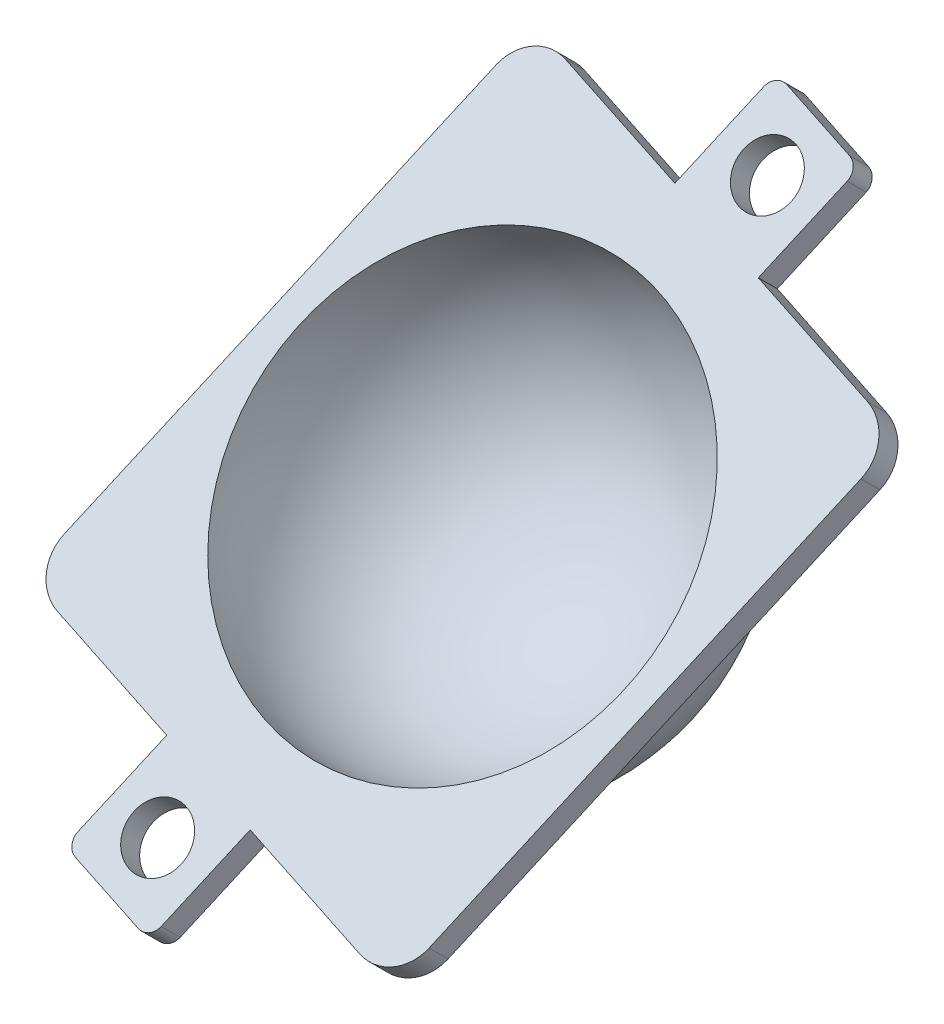
ISO-10303-21;
HEADER;
FILE_DESCRIPTION(('STEP AP214'),'2;1');
FILE_NAME('part.step','',(''),(''),'','','');
FILE_SCHEMA(('AUTOMOTIVE_DESIGN { 1 0 10303 214 1 1 1 1 }'));
ENDSEC;
DATA;
#1=APPLICATION_CONTEXT('core data for automotive mechanical design processes');
#2=APPLICATION_PROTOCOL_DEFINITION('international standard','automotive_design',2000,#1);
#3=PRODUCT_CONTEXT('',#1,'mechanical');
#4=PRODUCT('Part','Part','',(#3));
#5=PRODUCT_RELATED_PRODUCT_CATEGORY('part','',(#4));
#6=PRODUCT_DEFINITION_FORMATION('','',#4);
#7=PRODUCT_DEFINITION_CONTEXT('part definition',#1,'design');
#8=PRODUCT_DEFINITION('design','',#6,#7);
#9=PRODUCT_DEFINITION_SHAPE('','',#8);
#10=(LENGTH_UNIT() NAMED_UNIT(*) SI_UNIT(.MILLI.,.METRE.));
#11=(NAMED_UNIT(*) PLANE_ANGLE_UNIT() SI_UNIT($,.RADIAN.));
#12=(NAMED_UNIT(*) SI_UNIT($,.STERADIAN.) SOLID_ANGLE_UNIT());
#13=UNCERTAINTY_MEASURE_WITH_UNIT(LENGTH_MEASURE(1.E-05),#10,'distance_accuracy_value','');
#14=(GEOMETRIC_REPRESENTATION_CONTEXT(3) GLOBAL_UNCERTAINTY_ASSIGNED_CONTEXT((#13)) GLOBAL_UNIT_ASSIGNED_CONTEXT((#10,
#11,#12)) REPRESENTATION_CONTEXT('',''));
#15=CARTESIAN_POINT('',(0.,0.,0.));
#16=DIRECTION('',(0.,0.,1.));
#17=DIRECTION('',(1.,0.,0.));
#18=AXIS2_PLACEMENT_3D('',#15,#16,#17);
#19=CARTESIAN_POINT('',(22.5649035237231,-0.662825785926274,212.847546544747));
#20=DIRECTION('',(-0.264633616252294,-0.681897737622459,0.681897737622442));
#21=DIRECTION('',(-0.9643490286972,0.187124224581923,-0.187124224581909));
#22=AXIS2_PLACEMENT_3D('',#19,#20,#21);
#23=SPHERICAL_SURFACE('',#22,15.5);
#24=CARTESIAN_POINT('',(22.5649035237231,-0.662825785926274,212.847546544747));
#25=DIRECTION('',(0.,-0.707106781186538,-0.707106781186558));
#26=DIRECTION('',(-0.264633616252294,-0.681897737622459,0.681897737622442));
#27=AXIS2_PLACEMENT_3D('',#24,#25,#26);
#28=SPHERICAL_SURFACE('',#27,15.5);
#29=CARTESIAN_POINT('',(22.5649035237231,-0.662825785926274,212.847546544747));
#30=DIRECTION('',(0.,-0.707106781186538,-0.707106781186558));
#31=DIRECTION('',(-0.264633616252294,-0.681897737622459,0.681897737622442));
#32=AXIS2_PLACEMENT_3D('',#29,#30,#31);
#33=CIRCLE('',#32,15.5);
#34=CARTESIAN_POINT('',(18.4630824718125,-11.2322407190744,223.416961477895));
#35=VERTEX_POINT('',#34);
#36=EDGE_CURVE('E365',#35,#35,#33,.T.);
#37=ORIENTED_EDGE('',*,*,#36,.F.);
#38=EDGE_LOOP('',(#37));
#39=FACE_BOUND('',#38,.T.);
#40=ADVANCED_FACE('F37',(#39),#28,.F.);
#41=CARTESIAN_POINT('',(22.5649035237231,-0.662825785926274,212.847546544747));
#42=DIRECTION('',(0.,0.707106781186539,0.707106781186556));
#43=DIRECTION('',(-0.264633616252294,-0.681897737622459,0.681897737622442));
#44=AXIS2_PLACEMENT_3D('',#41,#42,#43);
#45=PLANE('',#44);
#46=ORIENTED_EDGE('',*,*,#36,.T.);
#47=EDGE_LOOP('',(#46));
#48=FACE_BOUND('',#47,.T.);
#49=CARTESIAN_POINT('',(28.9161103137782,15.7027199170127,196.482000841809));
#50=DIRECTION('',(0.,0.707106781186544,0.707106781186551));
#51=DIRECTION('',(-0.264633616252294,-0.681897737622454,0.681897737622447));
#52=AXIS2_PLACEMENT_3D('',#49,#50,#51);
#53=CIRCLE('',#52,2.24999999999999);
#54=CARTESIAN_POINT('',(28.3206846772105,14.1684500073622,198.016270751459));
#55=VERTEX_POINT('',#54);
#56=EDGE_CURVE('E362',#55,#55,#53,.T.);
#57=ORIENTED_EDGE('',*,*,#56,.F.);
#58=EDGE_LOOP('',(#57));
#59=FACE_BOUND('',#58,.T.);
#60=CARTESIAN_POINT('',(16.213696733668,-17.0283714888653,229.213092247686));
#61=DIRECTION('',(0.,0.707106781186544,0.707106781186551));
#62=DIRECTION('',(-0.264633616252294,-0.681897737622454,0.681897737622447));
#63=AXIS2_PLACEMENT_3D('',#60,#61,#62);
#64=CIRCLE('',#63,2.24999999999999);
#65=CARTESIAN_POINT('',(15.6182710971004,-18.5626413985158,230.747362157336));
#66=VERTEX_POINT('',#65);
#67=EDGE_CURVE('E356',#66,#66,#64,.T.);
#68=ORIENTED_EDGE('',*,*,#67,.F.);
#69=EDGE_LOOP('',(#68));
#70=FACE_BOUND('',#69,.T.);
#71=CARTESIAN_POINT('',(18.3128429710028,-19.6354373754783,231.820158134299));
#72=DIRECTION('',(0.,-0.707106781186544,-0.707106781186551));
#73=DIRECTION('',(0.264633616252294,0.681897737622454,-0.681897737622447));
#74=AXIS2_PLACEMENT_3D('',#71,#72,#73);
#75=CIRCLE('',#74,1.);
#76=CARTESIAN_POINT('',(19.2771919997,-19.8225616000602,232.007282358881));
#77=VERTEX_POINT('',#76);
#78=CARTESIAN_POINT('',(18.0482093547505,-20.3173351131007,232.502055871922));
#79=VERTEX_POINT('',#78);
#80=EDGE_CURVE('E267',#77,#79,#75,.T.);
#81=ORIENTED_EDGE('',*,*,#80,.F.);
#82=DIRECTION('',(0.264633616252294,0.681897737622454,-0.681897737622447));
#83=VECTOR('',#82,1.);
#84=CARTESIAN_POINT('',(19.2771919997,-19.8225616000602,232.007282358881));
#85=LINE('',#84,#83);
#86=CARTESIAN_POINT('',(21.129627313466,-15.049277436703,227.233998195524));
#87=VERTEX_POINT('',#86);
#88=EDGE_CURVE('E328',#77,#87,#85,.T.);
#89=ORIENTED_EDGE('',*,*,#88,.T.);
#90=DIRECTION('',(0.9643490286972,-0.187124224581918,0.187124224581914));
#91=VECTOR('',#90,1.);
#92=CARTESIAN_POINT('',(3.28917028256781,-11.5874792819376,223.772200040759));
#93=LINE('',#92,#91);
#94=CARTESIAN_POINT('',(31.2552921147866,-17.0140817948132,229.198802553634));
#95=VERTEX_POINT('',#94);
#96=EDGE_CURVE('E239',#87,#95,#93,.T.);
#97=ORIENTED_EDGE('',*,*,#96,.T.);
#98=CARTESIAN_POINT('',(32.0491929635435,-14.9683885819458,227.153109340767));
#99=DIRECTION('',(0.,-0.707106781186544,-0.707106781186551));
#100=DIRECTION('',(0.264633616252294,0.681897737622454,-0.681897737622447));
#101=AXIS2_PLACEMENT_3D('',#98,#99,#100);
#102=CIRCLE('',#101,3.);
#103=CARTESIAN_POINT('',(34.9422400496351,-15.5297612556916,227.714482014512));
#104=VERTEX_POINT('',#103);
#105=EDGE_CURVE('E236',#104,#95,#102,.T.);
#106=ORIENTED_EDGE('',*,*,#105,.F.);
#107=DIRECTION('',(0.264633616252294,0.681897737622454,-0.681897737622447));
#108=VECTOR('',#107,1.);
#109=CARTESIAN_POINT('',(34.9422400496351,-15.5297612556916,227.714482014512));
#110=LINE('',#109,#108);
#111=CARTESIAN_POINT('',(43.9397830022131,7.65476182347189,204.529958935349));
#112=VERTEX_POINT('',#111);
#113=EDGE_CURVE('E234',#104,#112,#110,.T.);
#114=ORIENTED_EDGE('',*,*,#113,.T.);
#115=CARTESIAN_POINT('',(41.0467359161215,8.21613449721764,203.968586261604));
#116=DIRECTION('',(0.,-0.707106781186544,-0.707106781186551));
#117=DIRECTION('',(0.264633616252294,0.681897737622454,-0.681897737622447));
#118=AXIS2_PLACEMENT_3D('',#115,#116,#117);
#119=CIRCLE('',#118,3.);
#120=CARTESIAN_POINT('',(41.8406367648784,10.261827710085,201.922893048736));
#121=VERTEX_POINT('',#120);
#122=EDGE_CURVE('E221',#121,#112,#119,.T.);
#123=ORIENTED_EDGE('',*,*,#122,.F.);
#124=DIRECTION('',(0.9643490286972,-0.187124224581918,0.187124224581914));
#125=VECTOR('',#124,1.);
#126=CARTESIAN_POINT('',(13.8745149326596,15.6884302229606,196.496290535861));
#127=LINE('',#126,#125);
#128=CARTESIAN_POINT('',(31.7149719635578,12.2266320681951,199.958088690626));
#129=VERTEX_POINT('',#128);
#130=EDGE_CURVE('E218',#129,#121,#127,.T.);
#131=ORIENTED_EDGE('',*,*,#130,.F.);
#132=DIRECTION('',(-0.264633616252294,-0.681897737622454,0.681897737622447));
#133=VECTOR('',#132,1.);
#134=CARTESIAN_POINT('',(33.5674072773238,16.9999162315523,195.184804527269));
#135=LINE('',#134,#133);
#136=CARTESIAN_POINT('',(33.5674072773238,16.9999162315523,195.184804527269));
#137=VERTEX_POINT('',#136);
#138=EDGE_CURVE('E196',#137,#129,#135,.T.);
#139=ORIENTED_EDGE('',*,*,#138,.F.);
#140=CARTESIAN_POINT('',(32.6030582486267,17.1870404561342,194.997680302687));
#141=DIRECTION('',(0.,-0.707106781186544,-0.707106781186551));
#142=DIRECTION('',(0.264633616252294,0.681897737622454,-0.681897737622447));
#143=AXIS2_PLACEMENT_3D('',#140,#141,#142);
#144=CIRCLE('',#143,1.);
#145=CARTESIAN_POINT('',(32.8676918648789,17.8689381937567,194.315782565065));
#146=VERTEX_POINT('',#145);
#147=EDGE_CURVE('E191',#146,#137,#144,.T.);
#148=ORIENTED_EDGE('',*,*,#147,.F.);
#149=DIRECTION('',(-0.9643490286972,0.187124224581918,-0.187124224581914));
#150=VECTOR('',#149,1.);
#151=CARTESIAN_POINT('',(32.8676918648789,17.8689381937567,194.315782565065));
#152=LINE('',#151,#150);
#153=CARTESIAN_POINT('',(27.0815976926957,18.9916835412482,193.193037217573));
#154=VERTEX_POINT('',#153);
#155=EDGE_CURVE('E170',#146,#154,#152,.T.);
#156=ORIENTED_EDGE('',*,*,#155,.T.);
#157=CARTESIAN_POINT('',(26.8169640764434,18.3097858036257,193.874934955196));
#158=DIRECTION('',(0.,0.707106781186544,0.707106781186551));
#159=DIRECTION('',(-0.264633616252294,-0.681897737622454,0.681897737622447));
#160=AXIS2_PLACEMENT_3D('',#157,#158,#159);
#161=CIRCLE('',#160,1.);
#162=CARTESIAN_POINT('',(25.8526150477462,18.4969100282077,193.687810730614));
#163=VERTEX_POINT('',#162);
#164=EDGE_CURVE('E179',#154,#163,#161,.T.);
#165=ORIENTED_EDGE('',*,*,#164,.T.);
#166=DIRECTION('',(-0.264633616252294,-0.681897737622454,0.681897737622447));
#167=VECTOR('',#166,1.);
#168=CARTESIAN_POINT('',(25.8526150477462,18.4969100282077,193.687810730614));
#169=LINE('',#168,#167);
#170=CARTESIAN_POINT('',(24.0001797339802,13.7236258648505,198.461094893971));
#171=VERTEX_POINT('',#170);
#172=EDGE_CURVE('E185',#163,#171,#169,.T.);
#173=ORIENTED_EDGE('',*,*,#172,.T.);
#174=CARTESIAN_POINT('',(13.8745149326596,15.6884302229606,196.496290535861));
#175=VERTEX_POINT('',#174);
#176=EDGE_CURVE('E225',#175,#171,#127,.T.);
#177=ORIENTED_EDGE('',*,*,#176,.F.);
#178=CARTESIAN_POINT('',(13.0806140839027,13.6427370100933,198.541983748728));
#179=DIRECTION('',(0.,-0.707106781186544,-0.707106781186551));
#180=DIRECTION('',(0.264633616252294,0.681897737622454,-0.681897737622447));
#181=AXIS2_PLACEMENT_3D('',#178,#179,#180);
#182=CIRCLE('',#181,3.);
#183=CARTESIAN_POINT('',(10.1875669978111,14.204109683839,197.980611074982));
#184=VERTEX_POINT('',#183);
#185=EDGE_CURVE('E226',#184,#175,#182,.T.);
#186=ORIENTED_EDGE('',*,*,#185,.F.);
#187=DIRECTION('',(0.264633616252294,0.681897737622454,-0.681897737622447));
#188=VECTOR('',#187,1.);
#189=CARTESIAN_POINT('',(1.19002404523309,-8.98041339532444,221.165134154145));
#190=LINE('',#189,#188);
#191=CARTESIAN_POINT('',(1.19002404523309,-8.98041339532444,221.165134154145));
#192=VERTEX_POINT('',#191);
#193=EDGE_CURVE('E229',#192,#184,#190,.T.);
#194=ORIENTED_EDGE('',*,*,#193,.F.);
#195=CARTESIAN_POINT('',(4.08307113132469,-9.54178606907019,221.726506827891));
#196=DIRECTION('',(0.,-0.707106781186544,-0.707106781186551));
#197=DIRECTION('',(0.264633616252294,0.681897737622454,-0.681897737622447));
#198=AXIS2_PLACEMENT_3D('',#195,#196,#197);
#199=CIRCLE('',#198,3.);
#200=CARTESIAN_POINT('',(3.28917028256781,-11.5874792819376,223.772200040759));
#201=VERTEX_POINT('',#200);
#202=EDGE_CURVE('E176',#201,#192,#199,.T.);
#203=ORIENTED_EDGE('',*,*,#202,.F.);
#204=CARTESIAN_POINT('',(13.4148350838884,-13.5522836400477,225.737004398869));
#205=VERTEX_POINT('',#204);
#206=EDGE_CURVE('E240',#201,#205,#93,.T.);
#207=ORIENTED_EDGE('',*,*,#206,.T.);
#208=DIRECTION('',(0.264633616252294,0.681897737622454,-0.681897737622447));
#209=VECTOR('',#208,1.);
#210=CARTESIAN_POINT('',(11.5623997701224,-18.3255678034049,230.510288562226));
#211=LINE('',#210,#209);
#212=CARTESIAN_POINT('',(11.5623997701224,-18.3255678034049,230.510288562226));
#213=VERTEX_POINT('',#212);
#214=EDGE_CURVE('E332',#213,#205,#211,.T.);
#215=ORIENTED_EDGE('',*,*,#214,.F.);
#216=CARTESIAN_POINT('',(12.5267487988196,-18.5126920279868,230.697412786808));
#217=DIRECTION('',(0.,0.707106781186544,0.707106781186551));
#218=DIRECTION('',(-0.264633616252294,-0.681897737622454,0.681897737622447));
#219=AXIS2_PLACEMENT_3D('',#216,#217,#218);
#220=CIRCLE('',#219,1.);
#221=CARTESIAN_POINT('',(12.2621151825673,-19.1945897656092,231.37931052443));
#222=VERTEX_POINT('',#221);
#223=EDGE_CURVE('E335',#213,#222,#220,.T.);
#224=ORIENTED_EDGE('',*,*,#223,.T.);
#225=DIRECTION('',(0.9643490286972,-0.187124224581918,0.187124224581914));
#226=VECTOR('',#225,1.);
#227=CARTESIAN_POINT('',(12.2621151825673,-19.1945897656092,231.37931052443));
#228=LINE('',#227,#226);
#229=EDGE_CURVE('E338',#222,#79,#228,.T.);
#230=ORIENTED_EDGE('',*,*,#229,.T.);
#231=EDGE_LOOP('',(#81,#89,#97,#106,#114,#123,#131,#139,#148,#156,#165,#173,#177,#186,#194,#203,
#207,#215,#224,#230));
#232=FACE_BOUND('',#231,.T.);
#233=ADVANCED_FACE('F189',(#48,#59,#70,#232),#45,.T.);
#234=CARTESIAN_POINT('',(19.2771919997,-21.2367751624333,230.593068796508));
#235=DIRECTION('',(0.9643490286972,-0.187124224581918,0.187124224581914));
#236=DIRECTION('',(0.,-0.707106781186544,-0.707106781186551));
#237=AXIS2_PLACEMENT_3D('',#234,#235,#236);
#238=PLANE('',#237);
#239=ORIENTED_EDGE('',*,*,#88,.F.);
#240=DIRECTION('',(0.,0.707106781186544,0.707106781186551));
#241=VECTOR('',#240,1.);
#242=CARTESIAN_POINT('',(19.2771919997,-21.2367751624333,230.593068796508));
#243=LINE('',#242,#241);
#244=CARTESIAN_POINT('',(19.2771919997,-21.2367751624333,230.593068796508));
#245=VERTEX_POINT('',#244);
#246=EDGE_CURVE('E54',#245,#77,#243,.T.);
#247=ORIENTED_EDGE('',*,*,#246,.F.);
#248=DIRECTION('',(0.264633616252294,0.681897737622454,-0.681897737622447));
#249=VECTOR('',#248,1.);
#250=CARTESIAN_POINT('',(19.2771919997,-21.2367751624333,230.593068796508));
#251=LINE('',#250,#249);
#252=CARTESIAN_POINT('',(21.129627313466,-16.4634909990761,225.819784633151));
#253=VERTEX_POINT('',#252);
#254=EDGE_CURVE('E327',#245,#253,#251,.T.);
#255=ORIENTED_EDGE('',*,*,#254,.T.);
#256=DIRECTION('',(0.,0.707106781186544,0.707106781186551));
#257=VECTOR('',#256,1.);
#258=CARTESIAN_POINT('',(21.129627313466,-16.4634909990761,225.819784633151));
#259=LINE('',#258,#257);
#260=EDGE_CURVE('E324',#253,#87,#259,.T.);
#261=ORIENTED_EDGE('',*,*,#260,.T.);
#262=EDGE_LOOP('',(#239,#247,#255,#261));
#263=FACE_BOUND('',#262,.T.);
#264=ADVANCED_FACE('F376',(#263),#238,.T.);
#265=CARTESIAN_POINT('',(3.2891702825678,-13.0016928443106,222.357986478385));
#266=DIRECTION('',(-0.264633616252294,-0.681897737622454,0.681897737622447));
#267=DIRECTION('',(0.,-0.707106781186544,-0.707106781186551));
#268=AXIS2_PLACEMENT_3D('',#265,#266,#267);
#269=PLANE('',#268);
#270=ORIENTED_EDGE('',*,*,#96,.F.);
#271=ORIENTED_EDGE('',*,*,#260,.F.);
#272=DIRECTION('',(0.9643490286972,-0.187124224581918,0.187124224581914));
#273=VECTOR('',#272,1.);
#274=CARTESIAN_POINT('',(3.2891702825678,-13.0016928443106,222.357986478385));
#275=LINE('',#274,#273);
#276=CARTESIAN_POINT('',(31.2552921147866,-18.4282953571863,227.784588991261));
#277=VERTEX_POINT('',#276);
#278=EDGE_CURVE('E293',#253,#277,#275,.T.);
#279=ORIENTED_EDGE('',*,*,#278,.T.);
#280=DIRECTION('',(0.,0.707106781186544,0.707106781186551));
#281=VECTOR('',#280,1.);
#282=CARTESIAN_POINT('',(31.2552921147866,-18.4282953571863,227.784588991261));
#283=LINE('',#282,#281);
#284=EDGE_CURVE('E246',#277,#95,#283,.T.);
#285=ORIENTED_EDGE('',*,*,#284,.T.);
#286=EDGE_LOOP('',(#270,#271,#279,#285));
#287=FACE_BOUND('',#286,.T.);
#288=ADVANCED_FACE('F392',(#287),#269,.T.);
#289=CARTESIAN_POINT('',(32.0491929635435,-16.3826021443189,225.738895778394));
#290=DIRECTION('',(0.,0.707106781186544,0.707106781186551));
#291=DIRECTION('',(-0.264633616252294,-0.681897737622454,0.681897737622447));
#292=AXIS2_PLACEMENT_3D('',#289,#290,#291);
#293=CYLINDRICAL_SURFACE('',#292,3.);
#294=ORIENTED_EDGE('',*,*,#105,.T.);
#295=ORIENTED_EDGE('',*,*,#284,.F.);
#296=CARTESIAN_POINT('',(32.0491929635435,-16.3826021443189,225.738895778394));
#297=DIRECTION('',(0.,-0.707106781186544,-0.707106781186551));
#298=DIRECTION('',(0.264633616252294,0.681897737622454,-0.681897737622447));
#299=AXIS2_PLACEMENT_3D('',#296,#297,#298);
#300=CIRCLE('',#299,3.);
#301=CARTESIAN_POINT('',(34.9422400496351,-16.9439748180646,226.300268452139));
#302=VERTEX_POINT('',#301);
#303=EDGE_CURVE('E290',#302,#277,#300,.T.);
#304=ORIENTED_EDGE('',*,*,#303,.F.);
#305=DIRECTION('',(0.,0.707106781186544,0.707106781186551));
#306=VECTOR('',#305,1.);
#307=CARTESIAN_POINT('',(34.9422400496351,-16.9439748180646,226.300268452139));
#308=LINE('',#307,#306);
#309=EDGE_CURVE('E250',#302,#104,#308,.T.);
#310=ORIENTED_EDGE('',*,*,#309,.T.);
#311=EDGE_LOOP('',(#294,#295,#304,#310));
#312=FACE_BOUND('',#311,.T.);
#313=ADVANCED_FACE('F411',(#312),#293,.T.);
#314=CARTESIAN_POINT('',(34.9422400496351,-16.9439748180646,226.300268452139));
#315=DIRECTION('',(0.9643490286972,-0.187124224581918,0.187124224581914));
#316=DIRECTION('',(0.,-0.707106781186544,-0.707106781186551));
#317=AXIS2_PLACEMENT_3D('',#314,#315,#316);
#318=PLANE('',#317);
#319=ORIENTED_EDGE('',*,*,#113,.F.);
#320=ORIENTED_EDGE('',*,*,#309,.F.);
#321=DIRECTION('',(0.264633616252294,0.681897737622454,-0.681897737622447));
#322=VECTOR('',#321,1.);
#323=CARTESIAN_POINT('',(34.9422400496351,-16.9439748180646,226.300268452139));
#324=LINE('',#323,#322);
#325=CARTESIAN_POINT('',(43.9397830022131,6.2405482610988,203.115745372976));
#326=VERTEX_POINT('',#325);
#327=EDGE_CURVE('E287',#302,#326,#324,.T.);
#328=ORIENTED_EDGE('',*,*,#327,.T.);
#329=DIRECTION('',(0.,0.707106781186544,0.707106781186551));
#330=VECTOR('',#329,1.);
#331=CARTESIAN_POINT('',(43.9397830022131,6.2405482610988,203.115745372976));
#332=LINE('',#331,#330);
#333=EDGE_CURVE('E252',#326,#112,#332,.T.);
#334=ORIENTED_EDGE('',*,*,#333,.T.);
#335=EDGE_LOOP('',(#319,#320,#328,#334));
#336=FACE_BOUND('',#335,.T.);
#337=ADVANCED_FACE('F415',(#336),#318,.T.);
#338=CARTESIAN_POINT('',(41.0467359161215,6.80192093484456,202.55437269923));
#339=DIRECTION('',(0.,0.707106781186544,0.707106781186551));
#340=DIRECTION('',(-0.264633616252294,-0.681897737622454,0.681897737622447));
#341=AXIS2_PLACEMENT_3D('',#338,#339,#340);
#342=CYLINDRICAL_SURFACE('',#341,3.);
#343=ORIENTED_EDGE('',*,*,#122,.T.);
#344=ORIENTED_EDGE('',*,*,#333,.F.);
#345=CARTESIAN_POINT('',(41.0467359161215,6.80192093484456,202.55437269923));
#346=DIRECTION('',(0.,-0.707106781186544,-0.707106781186551));
#347=DIRECTION('',(0.264633616252294,0.681897737622454,-0.681897737622447));
#348=AXIS2_PLACEMENT_3D('',#345,#346,#347);
#349=CIRCLE('',#348,3.);
#350=CARTESIAN_POINT('',(41.8406367648784,8.84761414771192,200.508679486363));
#351=VERTEX_POINT('',#350);
#352=EDGE_CURVE('E281',#351,#326,#349,.T.);
#353=ORIENTED_EDGE('',*,*,#352,.F.);
#354=DIRECTION('',(0.,0.707106781186544,0.707106781186551));
#355=VECTOR('',#354,1.);
#356=CARTESIAN_POINT('',(41.8406367648784,8.84761414771192,200.508679486363));
#357=LINE('',#356,#355);
#358=EDGE_CURVE('E254',#351,#121,#357,.T.);
#359=ORIENTED_EDGE('',*,*,#358,.T.);
#360=EDGE_LOOP('',(#343,#344,#353,#359));
#361=FACE_BOUND('',#360,.T.);
#362=ADVANCED_FACE('F419',(#361),#342,.T.);
#363=CARTESIAN_POINT('',(13.8745149326596,14.2742166605875,195.082076973488));
#364=DIRECTION('',(-0.264633616252294,-0.681897737622454,0.681897737622447));
#365=DIRECTION('',(0.,-0.707106781186544,-0.707106781186551));
#366=AXIS2_PLACEMENT_3D('',#363,#364,#365);
#367=PLANE('',#366);
#368=DIRECTION('',(0.,-0.707106781186544,-0.707106781186551));
#369=VECTOR('',#368,1.);
#370=CARTESIAN_POINT('',(31.7149719635578,10.8124185058221,198.543875128253));
#371=LINE('',#370,#369);
#372=CARTESIAN_POINT('',(31.7149719635578,10.8124185058221,198.543875128253));
#373=VERTEX_POINT('',#372);
#374=EDGE_CURVE('E214',#129,#373,#371,.T.);
#375=ORIENTED_EDGE('',*,*,#374,.F.);
#376=ORIENTED_EDGE('',*,*,#130,.T.);
#377=ORIENTED_EDGE('',*,*,#358,.F.);
#378=DIRECTION('',(0.9643490286972,-0.187124224581918,0.187124224581914));
#379=VECTOR('',#378,1.);
#380=CARTESIAN_POINT('',(13.8745149326596,14.2742166605875,195.082076973488));
#381=LINE('',#380,#379);
#382=EDGE_CURVE('E274',#373,#351,#381,.T.);
#383=ORIENTED_EDGE('',*,*,#382,.F.);
#384=EDGE_LOOP('',(#375,#376,#377,#383));
#385=FACE_BOUND('',#384,.T.);
#386=ADVANCED_FACE('F275',(#385),#367,.F.);
#387=CARTESIAN_POINT('',(33.5674072773238,15.5857026691792,193.770590964896));
#388=DIRECTION('',(-0.9643490286972,0.187124224581918,-0.187124224581914));
#389=DIRECTION('',(0.264633616252294,0.681897737622454,-0.681897737622447));
#390=AXIS2_PLACEMENT_3D('',#387,#388,#389);
#391=PLANE('',#390);
#392=ORIENTED_EDGE('',*,*,#138,.T.);
#393=ORIENTED_EDGE('',*,*,#374,.T.);
#394=DIRECTION('',(-0.264633616252294,-0.681897737622454,0.681897737622447));
#395=VECTOR('',#394,1.);
#396=CARTESIAN_POINT('',(33.5674072773238,15.5857026691792,193.770590964896));
#397=LINE('',#396,#395);
#398=CARTESIAN_POINT('',(33.5674072773238,15.5857026691792,193.770590964896));
#399=VERTEX_POINT('',#398);
#400=EDGE_CURVE('E205',#399,#373,#397,.T.);
#401=ORIENTED_EDGE('',*,*,#400,.F.);
#402=DIRECTION('',(0.,0.707106781186544,0.707106781186551));
#403=VECTOR('',#402,1.);
#404=CARTESIAN_POINT('',(33.5674072773238,15.5857026691792,193.770590964896));
#405=LINE('',#404,#403);
#406=EDGE_CURVE('E201',#399,#137,#405,.T.);
#407=ORIENTED_EDGE('',*,*,#406,.T.);
#408=EDGE_LOOP('',(#392,#393,#401,#407));
#409=FACE_BOUND('',#408,.T.);
#410=ADVANCED_FACE('F212',(#409),#391,.F.);
#411=CARTESIAN_POINT('',(32.6030582486266,15.7728268937612,193.583466740314));
#412=DIRECTION('',(0.,0.707106781186544,0.707106781186551));
#413=DIRECTION('',(-0.264633616252294,-0.681897737622454,0.681897737622447));
#414=AXIS2_PLACEMENT_3D('',#411,#412,#413);
#415=CYLINDRICAL_SURFACE('',#414,1.);
#416=ORIENTED_EDGE('',*,*,#147,.T.);
#417=ORIENTED_EDGE('',*,*,#406,.F.);
#418=CARTESIAN_POINT('',(32.6030582486266,15.7728268937612,193.583466740314));
#419=DIRECTION('',(0.,-0.707106781186544,-0.707106781186551));
#420=DIRECTION('',(0.264633616252294,0.681897737622454,-0.681897737622447));
#421=AXIS2_PLACEMENT_3D('',#418,#419,#420);
#422=CIRCLE('',#421,1.);
#423=CARTESIAN_POINT('',(32.8676918648789,16.4547246313836,192.901569002692));
#424=VERTEX_POINT('',#423);
#425=EDGE_CURVE('E203',#424,#399,#422,.T.);
#426=ORIENTED_EDGE('',*,*,#425,.F.);
#427=DIRECTION('',(0.,0.707106781186544,0.707106781186551));
#428=VECTOR('',#427,1.);
#429=CARTESIAN_POINT('',(32.8676918648789,16.4547246313836,192.901569002692));
#430=LINE('',#429,#428);
#431=EDGE_CURVE('E160',#424,#146,#430,.T.);
#432=ORIENTED_EDGE('',*,*,#431,.T.);
#433=EDGE_LOOP('',(#416,#417,#426,#432));
#434=FACE_BOUND('',#433,.T.);
#435=ADVANCED_FACE('F437',(#434),#415,.T.);
#436=CARTESIAN_POINT('',(32.8676918648789,16.4547246313836,192.901569002692));
#437=DIRECTION('',(0.264633616252294,0.681897737622454,-0.681897737622447));
#438=DIRECTION('',(0.,0.707106781186544,0.707106781186551));
#439=AXIS2_PLACEMENT_3D('',#436,#437,#438);
#440=PLANE('',#439);
#441=ORIENTED_EDGE('',*,*,#155,.F.);
#442=ORIENTED_EDGE('',*,*,#431,.F.);
#443=DIRECTION('',(-0.9643490286972,0.187124224581918,-0.187124224581914));
#444=VECTOR('',#443,1.);
#445=CARTESIAN_POINT('',(32.8676918648789,16.4547246313836,192.901569002692));
#446=LINE('',#445,#444);
#447=CARTESIAN_POINT('',(27.0815976926957,17.5774699788751,191.7788236552));
#448=VERTEX_POINT('',#447);
#449=EDGE_CURVE('E172',#424,#448,#446,.T.);
#450=ORIENTED_EDGE('',*,*,#449,.T.);
#451=DIRECTION('',(0.,0.707106781186544,0.707106781186551));
#452=VECTOR('',#451,1.);
#453=CARTESIAN_POINT('',(27.0815976926957,17.5774699788751,191.7788236552));
#454=LINE('',#453,#452);
#455=EDGE_CURVE('E166',#448,#154,#454,.T.);
#456=ORIENTED_EDGE('',*,*,#455,.T.);
#457=EDGE_LOOP('',(#441,#442,#450,#456));
#458=FACE_BOUND('',#457,.T.);
#459=ADVANCED_FACE('F168',(#458),#440,.T.);
#460=CARTESIAN_POINT('',(26.8169640764434,16.8955722412527,192.460721392822));
#461=DIRECTION('',(0.,0.707106781186544,0.707106781186551));
#462=DIRECTION('',(-0.264633616252294,-0.681897737622454,0.681897737622447));
#463=AXIS2_PLACEMENT_3D('',#460,#461,#462);
#464=CYLINDRICAL_SURFACE('',#463,1.);
#465=ORIENTED_EDGE('',*,*,#164,.F.);
#466=ORIENTED_EDGE('',*,*,#455,.F.);
#467=CARTESIAN_POINT('',(26.8169640764434,16.8955722412527,192.460721392822));
#468=DIRECTION('',(0.,0.707106781186544,0.707106781186551));
#469=DIRECTION('',(-0.264633616252294,-0.681897737622454,0.681897737622447));
#470=AXIS2_PLACEMENT_3D('',#467,#468,#469);
#471=CIRCLE('',#470,1.);
#472=CARTESIAN_POINT('',(25.8526150477462,17.0826964658346,192.273597168241));
#473=VERTEX_POINT('',#472);
#474=EDGE_CURVE('E192',#448,#473,#471,.T.);
#475=ORIENTED_EDGE('',*,*,#474,.T.);
#476=DIRECTION('',(0.,0.707106781186544,0.707106781186551));
#477=VECTOR('',#476,1.);
#478=CARTESIAN_POINT('',(25.8526150477462,17.0826964658346,192.273597168241));
#479=LINE('',#478,#477);
#480=EDGE_CURVE('E181',#473,#163,#479,.T.);
#481=ORIENTED_EDGE('',*,*,#480,.T.);
#482=EDGE_LOOP('',(#465,#466,#475,#481));
#483=FACE_BOUND('',#482,.T.);
#484=ADVANCED_FACE('F180',(#483),#464,.T.);
#485=CARTESIAN_POINT('',(25.8526150477462,17.0826964658346,192.273597168241));
#486=DIRECTION('',(-0.9643490286972,0.187124224581918,-0.187124224581914));
#487=DIRECTION('',(0.264633616252294,0.681897737622454,-0.681897737622447));
#488=AXIS2_PLACEMENT_3D('',#485,#486,#487);
#489=PLANE('',#488);
#490=ORIENTED_EDGE('',*,*,#172,.F.);
#491=ORIENTED_EDGE('',*,*,#480,.F.);
#492=DIRECTION('',(-0.264633616252294,-0.681897737622454,0.681897737622447));
#493=VECTOR('',#492,1.);
#494=CARTESIAN_POINT('',(25.8526150477462,17.0826964658346,192.273597168241));
#495=LINE('',#494,#493);
#496=CARTESIAN_POINT('',(24.0001797339802,12.3094123024774,197.046881331598));
#497=VERTEX_POINT('',#496);
#498=EDGE_CURVE('E194',#473,#497,#495,.T.);
#499=ORIENTED_EDGE('',*,*,#498,.T.);
#500=DIRECTION('',(0.,-0.707106781186544,-0.707106781186551));
#501=VECTOR('',#500,1.);
#502=CARTESIAN_POINT('',(24.0001797339802,12.3094123024774,197.046881331598));
#503=LINE('',#502,#501);
#504=EDGE_CURVE('E265',#171,#497,#503,.T.);
#505=ORIENTED_EDGE('',*,*,#504,.F.);
#506=EDGE_LOOP('',(#490,#491,#499,#505));
#507=FACE_BOUND('',#506,.T.);
#508=ADVANCED_FACE('F426',(#507),#489,.T.);
#509=ORIENTED_EDGE('',*,*,#176,.T.);
#510=ORIENTED_EDGE('',*,*,#504,.T.);
#511=CARTESIAN_POINT('',(13.8745149326596,14.2742166605875,195.082076973488));
#512=VERTEX_POINT('',#511);
#513=EDGE_CURVE('E277',#512,#497,#381,.T.);
#514=ORIENTED_EDGE('',*,*,#513,.F.);
#515=DIRECTION('',(0.,0.707106781186544,0.707106781186551));
#516=VECTOR('',#515,1.);
#517=CARTESIAN_POINT('',(13.8745149326596,14.2742166605875,195.082076973488));
#518=LINE('',#517,#516);
#519=EDGE_CURVE('E256',#512,#175,#518,.T.);
#520=ORIENTED_EDGE('',*,*,#519,.T.);
#521=EDGE_LOOP('',(#509,#510,#514,#520));
#522=FACE_BOUND('',#521,.T.);
#523=ADVANCED_FACE('F309',(#522),#367,.F.);
#524=CARTESIAN_POINT('',(13.0806140839027,12.2285234477202,197.127770186355));
#525=DIRECTION('',(0.,0.707106781186544,0.707106781186551));
#526=DIRECTION('',(-0.264633616252294,-0.681897737622454,0.681897737622447));
#527=AXIS2_PLACEMENT_3D('',#524,#525,#526);
#528=CYLINDRICAL_SURFACE('',#527,3.);
#529=ORIENTED_EDGE('',*,*,#185,.T.);
#530=ORIENTED_EDGE('',*,*,#519,.F.);
#531=CARTESIAN_POINT('',(13.0806140839027,12.2285234477202,197.127770186355));
#532=DIRECTION('',(0.,-0.707106781186544,-0.707106781186551));
#533=DIRECTION('',(0.264633616252294,0.681897737622454,-0.681897737622447));
#534=AXIS2_PLACEMENT_3D('',#531,#532,#533);
#535=CIRCLE('',#534,3.);
#536=CARTESIAN_POINT('',(10.1875669978111,12.7898961214659,196.566397512609));
#537=VERTEX_POINT('',#536);
#538=EDGE_CURVE('E278',#537,#512,#535,.T.);
#539=ORIENTED_EDGE('',*,*,#538,.F.);
#540=DIRECTION('',(0.,0.707106781186544,0.707106781186551));
#541=VECTOR('',#540,1.);
#542=CARTESIAN_POINT('',(10.1875669978111,12.7898961214659,196.566397512609));
#543=LINE('',#542,#541);
#544=EDGE_CURVE('E259',#537,#184,#543,.T.);
#545=ORIENTED_EDGE('',*,*,#544,.T.);
#546=EDGE_LOOP('',(#529,#530,#539,#545));
#547=FACE_BOUND('',#546,.T.);
#548=ADVANCED_FACE('F305',(#547),#528,.T.);
#549=CARTESIAN_POINT('',(1.19002404523308,-10.3946269576975,219.750920591772));
#550=DIRECTION('',(0.9643490286972,-0.187124224581918,0.187124224581914));
#551=DIRECTION('',(0.,-0.707106781186544,-0.707106781186551));
#552=AXIS2_PLACEMENT_3D('',#549,#550,#551);
#553=PLANE('',#552);
#554=ORIENTED_EDGE('',*,*,#193,.T.);
#555=ORIENTED_EDGE('',*,*,#544,.F.);
#556=DIRECTION('',(0.264633616252294,0.681897737622454,-0.681897737622447));
#557=VECTOR('',#556,1.);
#558=CARTESIAN_POINT('',(1.19002404523308,-10.3946269576975,219.750920591772));
#559=LINE('',#558,#557);
#560=CARTESIAN_POINT('',(1.19002404523308,-10.3946269576975,219.750920591772));
#561=VERTEX_POINT('',#560);
#562=EDGE_CURVE('E282',#561,#537,#559,.T.);
#563=ORIENTED_EDGE('',*,*,#562,.F.);
#564=DIRECTION('',(0.,0.707106781186544,0.707106781186551));
#565=VECTOR('',#564,1.);
#566=CARTESIAN_POINT('',(1.19002404523308,-10.3946269576975,219.750920591772));
#567=LINE('',#566,#565);
#568=EDGE_CURVE('E262',#561,#192,#567,.T.);
#569=ORIENTED_EDGE('',*,*,#568,.T.);
#570=EDGE_LOOP('',(#554,#555,#563,#569));
#571=FACE_BOUND('',#570,.T.);
#572=ADVANCED_FACE('F299',(#571),#553,.F.);
#573=CARTESIAN_POINT('',(4.08307113132469,-10.9559996314433,220.312293265518));
#574=DIRECTION('',(0.,0.707106781186544,0.707106781186551));
#575=DIRECTION('',(-0.264633616252294,-0.681897737622454,0.681897737622447));
#576=AXIS2_PLACEMENT_3D('',#573,#574,#575);
#577=CYLINDRICAL_SURFACE('',#576,3.);
#578=ORIENTED_EDGE('',*,*,#202,.T.);
#579=ORIENTED_EDGE('',*,*,#568,.F.);
#580=CARTESIAN_POINT('',(4.08307113132469,-10.9559996314433,220.312293265518));
#581=DIRECTION('',(0.,-0.707106781186544,-0.707106781186551));
#582=DIRECTION('',(0.264633616252294,0.681897737622454,-0.681897737622447));
#583=AXIS2_PLACEMENT_3D('',#580,#581,#582);
#584=CIRCLE('',#583,3.);
#585=CARTESIAN_POINT('',(3.2891702825678,-13.0016928443106,222.357986478385));
#586=VERTEX_POINT('',#585);
#587=EDGE_CURVE('E243',#586,#561,#584,.T.);
#588=ORIENTED_EDGE('',*,*,#587,.F.);
#589=DIRECTION('',(0.,0.707106781186544,0.707106781186551));
#590=VECTOR('',#589,1.);
#591=CARTESIAN_POINT('',(3.2891702825678,-13.0016928443106,222.357986478385));
#592=LINE('',#591,#590);
#593=EDGE_CURVE('E244',#586,#201,#592,.T.);
#594=ORIENTED_EDGE('',*,*,#593,.T.);
#595=EDGE_LOOP('',(#578,#579,#588,#594));
#596=FACE_BOUND('',#595,.T.);
#597=ADVANCED_FACE('F431',(#596),#577,.T.);
#598=CARTESIAN_POINT('',(13.4148350838884,-14.9664972024208,224.322790836496));
#599=VERTEX_POINT('',#598);
#600=EDGE_CURVE('E247',#586,#599,#275,.T.);
#601=ORIENTED_EDGE('',*,*,#600,.T.);
#602=DIRECTION('',(0.,0.707106781186544,0.707106781186551));
#603=VECTOR('',#602,1.);
#604=CARTESIAN_POINT('',(13.4148350838884,-14.9664972024208,224.322790836496));
#605=LINE('',#604,#603);
#606=EDGE_CURVE('E322',#599,#205,#605,.T.);
#607=ORIENTED_EDGE('',*,*,#606,.T.);
#608=ORIENTED_EDGE('',*,*,#206,.F.);
#609=ORIENTED_EDGE('',*,*,#593,.F.);
#610=EDGE_LOOP('',(#601,#607,#608,#609));
#611=FACE_BOUND('',#610,.T.);
#612=ADVANCED_FACE('F397',(#611),#269,.T.);
#613=CARTESIAN_POINT('',(11.5623997701224,-19.739781365778,229.096074999853));
#614=DIRECTION('',(0.9643490286972,-0.187124224581918,0.187124224581914));
#615=DIRECTION('',(0.,-0.707106781186544,-0.707106781186551));
#616=AXIS2_PLACEMENT_3D('',#613,#614,#615);
#617=PLANE('',#616);
#618=ORIENTED_EDGE('',*,*,#214,.T.);
#619=ORIENTED_EDGE('',*,*,#606,.F.);
#620=DIRECTION('',(0.264633616252294,0.681897737622454,-0.681897737622447));
#621=VECTOR('',#620,1.);
#622=CARTESIAN_POINT('',(11.5623997701224,-19.739781365778,229.096074999853));
#623=LINE('',#622,#621);
#624=CARTESIAN_POINT('',(11.5623997701224,-19.739781365778,229.096074999853));
#625=VERTEX_POINT('',#624);
#626=EDGE_CURVE('E344',#625,#599,#623,.T.);
#627=ORIENTED_EDGE('',*,*,#626,.F.);
#628=DIRECTION('',(0.,0.707106781186544,0.707106781186551));
#629=VECTOR('',#628,1.);
#630=CARTESIAN_POINT('',(11.5623997701224,-19.739781365778,229.096074999853));
#631=LINE('',#630,#629);
#632=EDGE_CURVE('E320',#625,#213,#631,.T.);
#633=ORIENTED_EDGE('',*,*,#632,.T.);
#634=EDGE_LOOP('',(#618,#619,#627,#633));
#635=FACE_BOUND('',#634,.T.);
#636=ADVANCED_FACE('F393',(#635),#617,.F.);
#637=CARTESIAN_POINT('',(12.5267487988196,-19.9269055903599,229.283199224435));
#638=DIRECTION('',(0.,0.707106781186544,0.707106781186551));
#639=DIRECTION('',(-0.264633616252294,-0.681897737622454,0.681897737622447));
#640=AXIS2_PLACEMENT_3D('',#637,#638,#639);
#641=CYLINDRICAL_SURFACE('',#640,1.);
#642=ORIENTED_EDGE('',*,*,#223,.F.);
#643=ORIENTED_EDGE('',*,*,#632,.F.);
#644=CARTESIAN_POINT('',(12.5267487988196,-19.9269055903599,229.283199224435));
#645=DIRECTION('',(0.,0.707106781186544,0.707106781186551));
#646=DIRECTION('',(-0.264633616252294,-0.681897737622454,0.681897737622447));
#647=AXIS2_PLACEMENT_3D('',#644,#645,#646);
#648=CIRCLE('',#647,1.);
#649=CARTESIAN_POINT('',(12.2621151825673,-20.6088033279823,229.965096962057));
#650=VERTEX_POINT('',#649);
#651=EDGE_CURVE('E347',#625,#650,#648,.T.);
#652=ORIENTED_EDGE('',*,*,#651,.T.);
#653=DIRECTION('',(0.,0.707106781186544,0.707106781186551));
#654=VECTOR('',#653,1.);
#655=CARTESIAN_POINT('',(12.2621151825673,-20.6088033279823,229.965096962057));
#656=LINE('',#655,#654);
#657=EDGE_CURVE('E318',#650,#222,#656,.T.);
#658=ORIENTED_EDGE('',*,*,#657,.T.);
#659=EDGE_LOOP('',(#642,#643,#652,#658));
#660=FACE_BOUND('',#659,.T.);
#661=ADVANCED_FACE('F396',(#660),#641,.T.);
#662=CARTESIAN_POINT('',(12.2621151825673,-20.6088033279823,229.965096962057));
#663=DIRECTION('',(-0.264633616252294,-0.681897737622454,0.681897737622447));
#664=DIRECTION('',(0.,-0.707106781186544,-0.707106781186551));
#665=AXIS2_PLACEMENT_3D('',#662,#663,#664);
#666=PLANE('',#665);
#667=ORIENTED_EDGE('',*,*,#229,.F.);
#668=ORIENTED_EDGE('',*,*,#657,.F.);
#669=DIRECTION('',(0.9643490286972,-0.187124224581918,0.187124224581914));
#670=VECTOR('',#669,1.);
#671=CARTESIAN_POINT('',(12.2621151825673,-20.6088033279823,229.965096962057));
#672=LINE('',#671,#670);
#673=CARTESIAN_POINT('',(18.0482093547505,-21.7315486754738,231.087842309549));
#674=VERTEX_POINT('',#673);
#675=EDGE_CURVE('E350',#650,#674,#672,.T.);
#676=ORIENTED_EDGE('',*,*,#675,.T.);
#677=DIRECTION('',(0.,0.707106781186544,0.707106781186551));
#678=VECTOR('',#677,1.);
#679=CARTESIAN_POINT('',(18.0482093547505,-21.7315486754738,231.087842309549));
#680=LINE('',#679,#678);
#681=EDGE_CURVE('E46',#674,#79,#680,.T.);
#682=ORIENTED_EDGE('',*,*,#681,.T.);
#683=EDGE_LOOP('',(#667,#668,#676,#682));
#684=FACE_BOUND('',#683,.T.);
#685=ADVANCED_FACE('F401',(#684),#666,.T.);
#686=CARTESIAN_POINT('',(18.3128429710028,-21.0496509378514,230.405944571926));
#687=DIRECTION('',(0.,0.707106781186544,0.707106781186551));
#688=DIRECTION('',(-0.264633616252294,-0.681897737622454,0.681897737622447));
#689=AXIS2_PLACEMENT_3D('',#686,#687,#688);
#690=CYLINDRICAL_SURFACE('',#689,1.);
#691=ORIENTED_EDGE('',*,*,#80,.T.);
#692=ORIENTED_EDGE('',*,*,#681,.F.);
#693=CARTESIAN_POINT('',(18.3128429710028,-21.0496509378514,230.405944571926));
#694=DIRECTION('',(0.,-0.707106781186544,-0.707106781186551));
#695=DIRECTION('',(0.264633616252294,0.681897737622454,-0.681897737622447));
#696=AXIS2_PLACEMENT_3D('',#693,#694,#695);
#697=CIRCLE('',#696,1.);
#698=EDGE_CURVE('E331',#245,#674,#697,.T.);
#699=ORIENTED_EDGE('',*,*,#698,.F.);
#700=ORIENTED_EDGE('',*,*,#246,.T.);
#701=EDGE_LOOP('',(#691,#692,#699,#700));
#702=FACE_BOUND('',#701,.T.);
#703=ADVANCED_FACE('F385',(#702),#690,.T.);
#704=CARTESIAN_POINT('',(16.213696733668,-17.0283714888653,229.213092247686));
#705=DIRECTION('',(0.,0.707106781186544,0.707106781186551));
#706=DIRECTION('',(-0.264633616252294,-0.681897737622454,0.681897737622447));
#707=AXIS2_PLACEMENT_3D('',#704,#705,#706);
#708=CYLINDRICAL_SURFACE('',#707,2.24999999999999);
#709=CARTESIAN_POINT('',(16.213696733668,-18.4425850512383,227.798878685313));
#710=DIRECTION('',(0.,-0.707106781186544,-0.707106781186551));
#711=DIRECTION('',(0.264633616252294,0.681897737622454,-0.681897737622447));
#712=AXIS2_PLACEMENT_3D('',#709,#710,#711);
#713=CIRCLE('',#712,2.24999999999999);
#714=CARTESIAN_POINT('',(16.8091223702357,-16.9083151415877,226.264608775663));
#715=VERTEX_POINT('',#714);
#716=EDGE_CURVE('E186',#715,#715,#713,.T.);
#717=ORIENTED_EDGE('',*,*,#716,.T.);
#718=EDGE_LOOP('',(#717));
#719=FACE_BOUND('',#718,.T.);
#720=ORIENTED_EDGE('',*,*,#67,.T.);
#721=EDGE_LOOP('',(#720));
#722=FACE_BOUND('',#721,.T.);
#723=ADVANCED_FACE('F381',(#719,#722),#708,.F.);
#724=CARTESIAN_POINT('',(28.9161103137782,15.7027199170127,196.482000841809));
#725=DIRECTION('',(0.,0.707106781186544,0.707106781186551));
#726=DIRECTION('',(-0.264633616252294,-0.681897737622454,0.681897737622447));
#727=AXIS2_PLACEMENT_3D('',#724,#725,#726);
#728=CYLINDRICAL_SURFACE('',#727,2.24999999999999);
#729=CARTESIAN_POINT('',(28.9161103137782,14.2885063546395,195.067787279436));
#730=DIRECTION('',(0.,-0.707106781186544,-0.707106781186551));
#731=DIRECTION('',(0.264633616252294,0.681897737622454,-0.681897737622447));
#732=AXIS2_PLACEMENT_3D('',#729,#730,#731);
#733=CIRCLE('',#732,2.24999999999999);
#734=CARTESIAN_POINT('',(29.5115359503458,15.8227762642901,193.533517369785));
#735=VERTEX_POINT('',#734);
#736=EDGE_CURVE('E359',#735,#735,#733,.T.);
#737=ORIENTED_EDGE('',*,*,#736,.T.);
#738=EDGE_LOOP('',(#737));
#739=FACE_BOUND('',#738,.T.);
#740=ORIENTED_EDGE('',*,*,#56,.T.);
#741=EDGE_LOOP('',(#740));
#742=FACE_BOUND('',#741,.T.);
#743=ADVANCED_FACE('F378',(#739,#742),#728,.F.);
#744=CARTESIAN_POINT('',(18.3128429710028,-21.0496509378514,230.405944571926));
#745=DIRECTION('',(0.,-0.707106781186544,-0.707106781186551));
#746=DIRECTION('',(0.264633616252294,0.681897737622454,-0.681897737622447));
#747=AXIS2_PLACEMENT_3D('',#744,#745,#746);
#748=PLANE('',#747);
#749=ORIENTED_EDGE('',*,*,#736,.F.);
#750=EDGE_LOOP('',(#749));
#751=FACE_BOUND('',#750,.T.);
#752=ORIENTED_EDGE('',*,*,#716,.F.);
#753=EDGE_LOOP('',(#752));
#754=FACE_BOUND('',#753,.T.);
#755=CARTESIAN_POINT('',(22.5649035237231,-2.07703934829936,211.433332982374));
#756=DIRECTION('',(0.,-0.707106781186544,-0.707106781186551));
#757=DIRECTION('',(0.264633616252294,0.681897737622454,-0.681897737622447));
#758=AXIS2_PLACEMENT_3D('',#755,#756,#757);
#759=CIRCLE('',#758,16.3783393541592);
#760=CARTESIAN_POINT('',(26.8991626952215,9.09131320331461,200.26498043076));
#761=VERTEX_POINT('',#760);
#762=EDGE_CURVE('E11',#761,#761,#759,.T.);
#763=ORIENTED_EDGE('',*,*,#762,.F.);
#764=EDGE_LOOP('',(#763));
#765=FACE_BOUND('',#764,.T.);
#766=ORIENTED_EDGE('',*,*,#698,.T.);
#767=ORIENTED_EDGE('',*,*,#675,.F.);
#768=ORIENTED_EDGE('',*,*,#651,.F.);
#769=ORIENTED_EDGE('',*,*,#626,.T.);
#770=ORIENTED_EDGE('',*,*,#600,.F.);
#771=ORIENTED_EDGE('',*,*,#587,.T.);
#772=ORIENTED_EDGE('',*,*,#562,.T.);
#773=ORIENTED_EDGE('',*,*,#538,.T.);
#774=ORIENTED_EDGE('',*,*,#513,.T.);
#775=ORIENTED_EDGE('',*,*,#498,.F.);
#776=ORIENTED_EDGE('',*,*,#474,.F.);
#777=ORIENTED_EDGE('',*,*,#449,.F.);
#778=ORIENTED_EDGE('',*,*,#425,.T.);
#779=ORIENTED_EDGE('',*,*,#400,.T.);
#780=ORIENTED_EDGE('',*,*,#382,.T.);
#781=ORIENTED_EDGE('',*,*,#352,.T.);
#782=ORIENTED_EDGE('',*,*,#327,.F.);
#783=ORIENTED_EDGE('',*,*,#303,.T.);
#784=ORIENTED_EDGE('',*,*,#278,.F.);
#785=ORIENTED_EDGE('',*,*,#254,.F.);
#786=EDGE_LOOP('',(#766,#767,#768,#769,#770,#771,#772,#773,#774,#775,#776,#777,#778,#779,#780,
#781,#782,#783,#784,#785));
#787=FACE_BOUND('',#786,.T.);
#788=ADVANCED_FACE('F273',(#751,#754,#765,#787),#748,.T.);
#789=CARTESIAN_POINT('',(22.5649035237231,-0.662825785926274,212.847546544747));
#790=DIRECTION('',(-0.9643490286972,0.187124224581918,-0.187124224581914));
#791=DIRECTION('',(-0.264633616252294,-0.681897737622459,0.681897737622442));
#792=AXIS2_PLACEMENT_3D('',#789,#790,#791);
#793=SPHERICAL_SURFACE('',#792,16.5);
#794=CARTESIAN_POINT('',(22.5649035237231,-0.662825785926274,212.847546544747));
#795=DIRECTION('',(0.,-0.707106781186544,-0.707106781186551));
#796=DIRECTION('',(0.264633616252294,0.681897737622454,-0.681897737622447));
#797=AXIS2_PLACEMENT_3D('',#794,#795,#796);
#798=SPHERICAL_SURFACE('',#797,16.5);
#799=ORIENTED_EDGE('',*,*,#762,.T.);
#800=EDGE_LOOP('',(#799));
#801=FACE_BOUND('',#800,.T.);
#802=ADVANCED_FACE('F39',(#801),#798,.T.);
#803=CLOSED_SHELL('',(#40,#233,#264,#288,#313,#337,#362,#386,#410,#435,#459,#484,#508,#523,#548,
#572,#597,#612,#636,#661,#685,#703,#723,#743,#788,#802));
#804=MANIFOLD_SOLID_BREP('B2',#803);
#805=ADVANCED_BREP_SHAPE_REPRESENTATION('',(#18,#804),#14);
#806=SHAPE_DEFINITION_REPRESENTATION(#9,#805);
ENDSEC;
END-ISO-10303-21;
